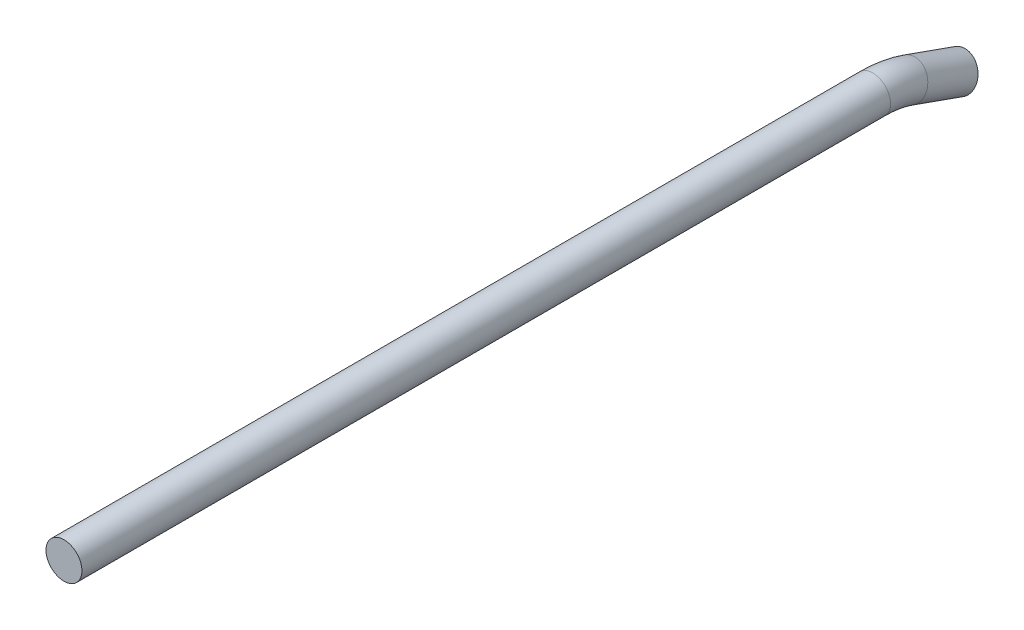
ISO-10303-21;
HEADER;
FILE_DESCRIPTION(('STEP AP214'),'2;1');
FILE_NAME('part.step','',(''),(''),'','','');
FILE_SCHEMA(('AUTOMOTIVE_DESIGN { 1 0 10303 214 1 1 1 1 }'));
ENDSEC;
DATA;
#1=APPLICATION_CONTEXT('core data for automotive mechanical design processes');
#2=APPLICATION_PROTOCOL_DEFINITION('international standard','automotive_design',2000,#1);
#3=PRODUCT_CONTEXT('',#1,'mechanical');
#4=PRODUCT('Part','Part','',(#3));
#5=PRODUCT_RELATED_PRODUCT_CATEGORY('part','',(#4));
#6=PRODUCT_DEFINITION_FORMATION('','',#4);
#7=PRODUCT_DEFINITION_CONTEXT('part definition',#1,'design');
#8=PRODUCT_DEFINITION('design','',#6,#7);
#9=PRODUCT_DEFINITION_SHAPE('','',#8);
#10=(LENGTH_UNIT() NAMED_UNIT(*) SI_UNIT(.MILLI.,.METRE.));
#11=(NAMED_UNIT(*) PLANE_ANGLE_UNIT() SI_UNIT($,.RADIAN.));
#12=(NAMED_UNIT(*) SI_UNIT($,.STERADIAN.) SOLID_ANGLE_UNIT());
#13=UNCERTAINTY_MEASURE_WITH_UNIT(LENGTH_MEASURE(1.E-05),#10,'distance_accuracy_value','');
#14=(GEOMETRIC_REPRESENTATION_CONTEXT(3) GLOBAL_UNCERTAINTY_ASSIGNED_CONTEXT((#13)) GLOBAL_UNIT_ASSIGNED_CONTEXT((#10,
#11,#12)) REPRESENTATION_CONTEXT('',''));
#15=CARTESIAN_POINT('',(0.,0.,0.));
#16=DIRECTION('',(0.,0.,1.));
#17=DIRECTION('',(1.,0.,0.));
#18=AXIS2_PLACEMENT_3D('',#15,#16,#17);
#19=CARTESIAN_POINT('',(0.,0.,0.));
#20=DIRECTION('',(0.,0.,1.));
#21=DIRECTION('',(1.,0.,0.));
#22=AXIS2_PLACEMENT_3D('',#19,#20,#21);
#23=PLANE('',#22);
#24=CARTESIAN_POINT('',(0.,0.,0.));
#25=DIRECTION('',(0.,0.,1.));
#26=DIRECTION('',(1.,0.,0.));
#27=AXIS2_PLACEMENT_3D('',#24,#25,#26);
#28=CIRCLE('',#27,0.5);
#29=CARTESIAN_POINT('',(0.5,0.,0.));
#30=VERTEX_POINT('',#29);
#31=EDGE_CURVE('E44',#30,#30,#28,.T.);
#32=ORIENTED_EDGE('',*,*,#31,.T.);
#33=EDGE_LOOP('',(#32));
#34=FACE_BOUND('',#33,.T.);
#35=ADVANCED_FACE('F32',(#34),#23,.T.);
#36=CARTESIAN_POINT('',(0.,-0.670903139500512,-24.8841149055746));
#37=DIRECTION('',(0.,0.335451569750256,0.942057452787296));
#38=DIRECTION('',(1.,0.,0.));
#39=AXIS2_PLACEMENT_3D('',#36,#37,#38);
#40=PLANE('',#39);
#41=CARTESIAN_POINT('',(0.,-0.670903139500512,-24.8841149055746));
#42=DIRECTION('',(0.,0.335451569750256,0.942057452787296));
#43=DIRECTION('',(1.,0.,0.));
#44=AXIS2_PLACEMENT_3D('',#41,#42,#43);
#45=CIRCLE('',#44,0.5);
#46=CARTESIAN_POINT('',(0.5,-0.670903139500512,-24.8841149055746));
#47=VERTEX_POINT('',#46);
#48=EDGE_CURVE('E11',#47,#47,#45,.T.);
#49=ORIENTED_EDGE('',*,*,#48,.F.);
#50=EDGE_LOOP('',(#49));
#51=FACE_BOUND('',#50,.T.);
#52=ADVANCED_FACE('F50',(#51),#40,.F.);
#53=CARTESIAN_POINT('',(0.,0.,0.));
#54=DIRECTION('',(0.,0.,-1.));
#55=DIRECTION('',(-1.,0.,0.));
#56=AXIS2_PLACEMENT_3D('',#53,#54,#55);
#57=CYLINDRICAL_SURFACE('',#56,0.5);
#58=CARTESIAN_POINT('',(0.,0.,-22.4818100217342));
#59=DIRECTION('',(0.,0.,1.));
#60=DIRECTION('',(1.,0.,0.));
#61=AXIS2_PLACEMENT_3D('',#58,#59,#60);
#62=CIRCLE('',#61,0.5);
#63=CARTESIAN_POINT('',(0.,0.5,-22.4818100217342));
#64=VERTEX_POINT('',#63);
#65=EDGE_CURVE('E75',#64,#64,#62,.T.);
#66=ORIENTED_EDGE('',*,*,#65,.T.);
#67=EDGE_LOOP('',(#66));
#68=FACE_BOUND('',#67,.T.);
#69=ORIENTED_EDGE('',*,*,#31,.F.);
#70=EDGE_LOOP('',(#69));
#71=FACE_BOUND('',#70,.T.);
#72=ADVANCED_FACE('F52',(#68,#71),#57,.T.);
#73=CARTESIAN_POINT('',(0.,-3.,-22.4818100217342));
#74=DIRECTION('',(-1.,0.,0.));
#75=DIRECTION('',(0.,0.,1.));
#76=AXIS2_PLACEMENT_3D('',#73,#74,#75);
#77=TOROIDAL_SURFACE('',#76,3.,0.5);
#78=CARTESIAN_POINT('',(0.,-0.173827641638114,-23.488164730985));
#79=DIRECTION('',(0.,0.335451569750259,0.942057452787295));
#80=DIRECTION('',(1.,0.,0.));
#81=AXIS2_PLACEMENT_3D('',#78,#79,#80);
#82=CIRCLE('',#81,0.5);
#83=CARTESIAN_POINT('',(0.,0.297201084755533,-23.6558905158601));
#84=VERTEX_POINT('',#83);
#85=EDGE_CURVE('E39',#84,#84,#82,.T.);
#86=CARTESIAN_POINT('',(0.,-3.,-22.4818100217342));
#87=DIRECTION('',(-1.,0.,0.));
#88=DIRECTION('',(0.,0.,1.));
#89=AXIS2_PLACEMENT_3D('',#86,#87,#88);
#90=CIRCLE('',#89,3.5);
#91=EDGE_CURVE('',#64,#84,#90,.T.);
#92=ORIENTED_EDGE('',*,*,#65,.F.);
#93=ORIENTED_EDGE('',*,*,#85,.T.);
#94=ORIENTED_EDGE('',*,*,#91,.T.);
#95=ORIENTED_EDGE('',*,*,#91,.F.);
#96=EDGE_LOOP('',(#92,#94,#93,#95));
#97=FACE_BOUND('',#96,.T.);
#98=ADVANCED_FACE('F57',(#97),#77,.T.);
#99=CARTESIAN_POINT('',(0.,-0.173827641638114,-23.488164730985));
#100=DIRECTION('',(0.,-0.335451569750256,-0.942057452787296));
#101=DIRECTION('',(0.,0.942057452787296,-0.335451569750256));
#102=AXIS2_PLACEMENT_3D('',#99,#100,#101);
#103=CYLINDRICAL_SURFACE('',#102,0.5);
#104=ORIENTED_EDGE('',*,*,#48,.T.);
#105=EDGE_LOOP('',(#104));
#106=FACE_BOUND('',#105,.T.);
#107=ORIENTED_EDGE('',*,*,#85,.F.);
#108=EDGE_LOOP('',(#107));
#109=FACE_BOUND('',#108,.T.);
#110=ADVANCED_FACE('F47',(#106,#109),#103,.T.);
#111=CLOSED_SHELL('',(#35,#52,#72,#98,#110));
#112=MANIFOLD_SOLID_BREP('B2',#111);
#113=ADVANCED_BREP_SHAPE_REPRESENTATION('',(#18,#112),#14);
#114=SHAPE_DEFINITION_REPRESENTATION(#9,#113);
ENDSEC;
END-ISO-10303-21;
